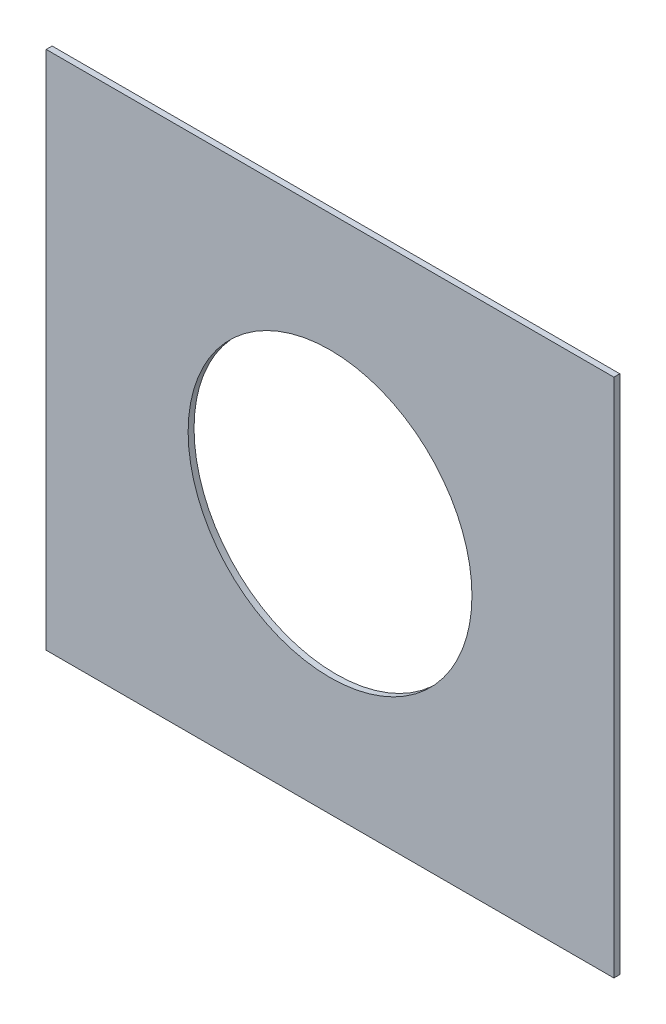
ISO-10303-21;
HEADER;
FILE_DESCRIPTION(('STEP AP214'),'2;1');
FILE_NAME('part.step','',(''),(''),'','','');
FILE_SCHEMA(('AUTOMOTIVE_DESIGN { 1 0 10303 214 1 1 1 1 }'));
ENDSEC;
DATA;
#1=APPLICATION_CONTEXT('core data for automotive mechanical design processes');
#2=APPLICATION_PROTOCOL_DEFINITION('international standard','automotive_design',2000,#1);
#3=PRODUCT_CONTEXT('',#1,'mechanical');
#4=PRODUCT('Part','Part','',(#3));
#5=PRODUCT_RELATED_PRODUCT_CATEGORY('part','',(#4));
#6=PRODUCT_DEFINITION_FORMATION('','',#4);
#7=PRODUCT_DEFINITION_CONTEXT('part definition',#1,'design');
#8=PRODUCT_DEFINITION('design','',#6,#7);
#9=PRODUCT_DEFINITION_SHAPE('','',#8);
#10=(LENGTH_UNIT() NAMED_UNIT(*) SI_UNIT(.MILLI.,.METRE.));
#11=(NAMED_UNIT(*) PLANE_ANGLE_UNIT() SI_UNIT($,.RADIAN.));
#12=(NAMED_UNIT(*) SI_UNIT($,.STERADIAN.) SOLID_ANGLE_UNIT());
#13=UNCERTAINTY_MEASURE_WITH_UNIT(LENGTH_MEASURE(1.E-05),#10,'distance_accuracy_value','');
#14=(GEOMETRIC_REPRESENTATION_CONTEXT(3) GLOBAL_UNCERTAINTY_ASSIGNED_CONTEXT((#13)) GLOBAL_UNIT_ASSIGNED_CONTEXT((#10,
#11,#12)) REPRESENTATION_CONTEXT('',''));
#15=CARTESIAN_POINT('',(0.,0.,0.));
#16=DIRECTION('',(0.,0.,1.));
#17=DIRECTION('',(1.,0.,0.));
#18=AXIS2_PLACEMENT_3D('',#15,#16,#17);
#19=CARTESIAN_POINT('',(1200.,-1100.,25.));
#20=DIRECTION('',(-1.,0.,0.));
#21=DIRECTION('',(0.,0.,1.));
#22=AXIS2_PLACEMENT_3D('',#19,#20,#21);
#23=PLANE('',#22);
#24=DIRECTION('',(0.,1.,0.));
#25=VECTOR('',#24,1.);
#26=CARTESIAN_POINT('',(1200.,-1100.,0.));
#27=LINE('',#26,#25);
#28=CARTESIAN_POINT('',(1200.,-1100.,0.));
#29=VERTEX_POINT('',#28);
#30=CARTESIAN_POINT('',(1200.,1100.,0.));
#31=VERTEX_POINT('',#30);
#32=EDGE_CURVE('E114',#29,#31,#27,.T.);
#33=ORIENTED_EDGE('',*,*,#32,.T.);
#34=DIRECTION('',(0.,0.,-1.));
#35=VECTOR('',#34,1.);
#36=CARTESIAN_POINT('',(1200.,1100.,25.));
#37=LINE('',#36,#35);
#38=CARTESIAN_POINT('',(1200.,1100.,25.));
#39=VERTEX_POINT('',#38);
#40=EDGE_CURVE('E11',#39,#31,#37,.T.);
#41=ORIENTED_EDGE('',*,*,#40,.F.);
#42=DIRECTION('',(0.,1.,0.));
#43=VECTOR('',#42,1.);
#44=CARTESIAN_POINT('',(1200.,-1100.,25.));
#45=LINE('',#44,#43);
#46=CARTESIAN_POINT('',(1200.,-1100.,25.));
#47=VERTEX_POINT('',#46);
#48=EDGE_CURVE('E97',#47,#39,#45,.T.);
#49=ORIENTED_EDGE('',*,*,#48,.F.);
#50=DIRECTION('',(0.,0.,-1.));
#51=VECTOR('',#50,1.);
#52=CARTESIAN_POINT('',(1200.,-1100.,25.));
#53=LINE('',#52,#51);
#54=EDGE_CURVE('E110',#47,#29,#53,.T.);
#55=ORIENTED_EDGE('',*,*,#54,.T.);
#56=EDGE_LOOP('',(#33,#41,#49,#55));
#57=FACE_BOUND('',#56,.T.);
#58=ADVANCED_FACE('F44',(#57),#23,.F.);
#59=CARTESIAN_POINT('',(-1200.,1100.,25.));
#60=DIRECTION('',(0.,-1.,0.));
#61=DIRECTION('',(0.,0.,-1.));
#62=AXIS2_PLACEMENT_3D('',#59,#60,#61);
#63=PLANE('',#62);
#64=DIRECTION('',(-1.,0.,0.));
#65=VECTOR('',#64,1.);
#66=CARTESIAN_POINT('',(-1200.,1100.,0.));
#67=LINE('',#66,#65);
#68=CARTESIAN_POINT('',(-1200.,1100.,0.));
#69=VERTEX_POINT('',#68);
#70=EDGE_CURVE('E102',#31,#69,#67,.T.);
#71=ORIENTED_EDGE('',*,*,#70,.T.);
#72=DIRECTION('',(0.,0.,-1.));
#73=VECTOR('',#72,1.);
#74=CARTESIAN_POINT('',(-1200.,1100.,25.));
#75=LINE('',#74,#73);
#76=CARTESIAN_POINT('',(-1200.,1100.,25.));
#77=VERTEX_POINT('',#76);
#78=EDGE_CURVE('E54',#77,#69,#75,.T.);
#79=ORIENTED_EDGE('',*,*,#78,.F.);
#80=DIRECTION('',(-1.,0.,0.));
#81=VECTOR('',#80,1.);
#82=CARTESIAN_POINT('',(-1200.,1100.,25.));
#83=LINE('',#82,#81);
#84=EDGE_CURVE('E92',#39,#77,#83,.T.);
#85=ORIENTED_EDGE('',*,*,#84,.F.);
#86=ORIENTED_EDGE('',*,*,#40,.T.);
#87=EDGE_LOOP('',(#71,#79,#85,#86));
#88=FACE_BOUND('',#87,.T.);
#89=ADVANCED_FACE('F101',(#88),#63,.F.);
#90=CARTESIAN_POINT('',(-1200.,-1100.,25.));
#91=DIRECTION('',(1.,0.,0.));
#92=DIRECTION('',(0.,0.,-1.));
#93=AXIS2_PLACEMENT_3D('',#90,#91,#92);
#94=PLANE('',#93);
#95=DIRECTION('',(0.,-1.,0.));
#96=VECTOR('',#95,1.);
#97=CARTESIAN_POINT('',(-1200.,-1100.,0.));
#98=LINE('',#97,#96);
#99=CARTESIAN_POINT('',(-1200.,-1100.,0.));
#100=VERTEX_POINT('',#99);
#101=EDGE_CURVE('E79',#69,#100,#98,.T.);
#102=ORIENTED_EDGE('',*,*,#101,.T.);
#103=DIRECTION('',(0.,0.,-1.));
#104=VECTOR('',#103,1.);
#105=CARTESIAN_POINT('',(-1200.,-1100.,25.));
#106=LINE('',#105,#104);
#107=CARTESIAN_POINT('',(-1200.,-1100.,25.));
#108=VERTEX_POINT('',#107);
#109=EDGE_CURVE('E104',#108,#100,#106,.T.);
#110=ORIENTED_EDGE('',*,*,#109,.F.);
#111=DIRECTION('',(0.,-1.,0.));
#112=VECTOR('',#111,1.);
#113=CARTESIAN_POINT('',(-1200.,-1100.,25.));
#114=LINE('',#113,#112);
#115=EDGE_CURVE('E95',#77,#108,#114,.T.);
#116=ORIENTED_EDGE('',*,*,#115,.F.);
#117=ORIENTED_EDGE('',*,*,#78,.T.);
#118=EDGE_LOOP('',(#102,#110,#116,#117));
#119=FACE_BOUND('',#118,.T.);
#120=ADVANCED_FACE('F106',(#119),#94,.F.);
#121=CARTESIAN_POINT('',(-1200.,-1100.,25.));
#122=DIRECTION('',(0.,1.,0.));
#123=DIRECTION('',(0.,0.,1.));
#124=AXIS2_PLACEMENT_3D('',#121,#122,#123);
#125=PLANE('',#124);
#126=DIRECTION('',(1.,0.,0.));
#127=VECTOR('',#126,1.);
#128=CARTESIAN_POINT('',(-1200.,-1100.,0.));
#129=LINE('',#128,#127);
#130=EDGE_CURVE('E85',#100,#29,#129,.T.);
#131=ORIENTED_EDGE('',*,*,#130,.T.);
#132=ORIENTED_EDGE('',*,*,#54,.F.);
#133=DIRECTION('',(1.,0.,0.));
#134=VECTOR('',#133,1.);
#135=CARTESIAN_POINT('',(-1200.,-1100.,25.));
#136=LINE('',#135,#134);
#137=EDGE_CURVE('E62',#108,#47,#136,.T.);
#138=ORIENTED_EDGE('',*,*,#137,.F.);
#139=ORIENTED_EDGE('',*,*,#109,.T.);
#140=EDGE_LOOP('',(#131,#132,#138,#139));
#141=FACE_BOUND('',#140,.T.);
#142=ADVANCED_FACE('F127',(#141),#125,.F.);
#143=CARTESIAN_POINT('',(0.,0.,25.));
#144=DIRECTION('',(0.,0.,-1.));
#145=DIRECTION('',(-1.,0.,0.));
#146=AXIS2_PLACEMENT_3D('',#143,#144,#145);
#147=PLANE('',#146);
#148=CARTESIAN_POINT('',(0.,0.,25.));
#149=DIRECTION('',(0.,0.,1.));
#150=DIRECTION('',(1.,0.,0.));
#151=AXIS2_PLACEMENT_3D('',#148,#149,#150);
#152=CIRCLE('',#151,600.);
#153=CARTESIAN_POINT('',(600.,0.,25.));
#154=VERTEX_POINT('',#153);
#155=EDGE_CURVE('E134',#154,#154,#152,.T.);
#156=ORIENTED_EDGE('',*,*,#155,.F.);
#157=EDGE_LOOP('',(#156));
#158=FACE_BOUND('',#157,.T.);
#159=ORIENTED_EDGE('',*,*,#48,.T.);
#160=ORIENTED_EDGE('',*,*,#84,.T.);
#161=ORIENTED_EDGE('',*,*,#115,.T.);
#162=ORIENTED_EDGE('',*,*,#137,.T.);
#163=EDGE_LOOP('',(#159,#160,#161,#162));
#164=FACE_BOUND('',#163,.T.);
#165=ADVANCED_FACE('F93',(#158,#164),#147,.F.);
#166=CARTESIAN_POINT('',(0.,0.,0.));
#167=DIRECTION('',(0.,0.,-1.));
#168=DIRECTION('',(-1.,0.,0.));
#169=AXIS2_PLACEMENT_3D('',#166,#167,#168);
#170=PLANE('',#169);
#171=CARTESIAN_POINT('',(0.,0.,0.));
#172=DIRECTION('',(0.,0.,-1.));
#173=DIRECTION('',(-1.,0.,0.));
#174=AXIS2_PLACEMENT_3D('',#171,#172,#173);
#175=CIRCLE('',#174,600.);
#176=CARTESIAN_POINT('',(-600.,0.,0.));
#177=VERTEX_POINT('',#176);
#178=EDGE_CURVE('E47',#177,#177,#175,.T.);
#179=ORIENTED_EDGE('',*,*,#178,.F.);
#180=EDGE_LOOP('',(#179));
#181=FACE_BOUND('',#180,.T.);
#182=ORIENTED_EDGE('',*,*,#32,.F.);
#183=ORIENTED_EDGE('',*,*,#130,.F.);
#184=ORIENTED_EDGE('',*,*,#101,.F.);
#185=ORIENTED_EDGE('',*,*,#70,.F.);
#186=EDGE_LOOP('',(#182,#183,#184,#185));
#187=FACE_BOUND('',#186,.T.);
#188=ADVANCED_FACE('F130',(#181,#187),#170,.T.);
#189=CARTESIAN_POINT('',(0.,0.,-6.99999999999995));
#190=DIRECTION('',(0.,0.,1.));
#191=DIRECTION('',(1.,0.,0.));
#192=AXIS2_PLACEMENT_3D('',#189,#190,#191);
#193=CYLINDRICAL_SURFACE('',#192,600.);
#194=ORIENTED_EDGE('',*,*,#178,.T.);
#195=EDGE_LOOP('',(#194));
#196=FACE_BOUND('',#195,.T.);
#197=ORIENTED_EDGE('',*,*,#155,.T.);
#198=EDGE_LOOP('',(#197));
#199=FACE_BOUND('',#198,.T.);
#200=ADVANCED_FACE('F143',(#196,#199),#193,.F.);
#201=CLOSED_SHELL('',(#58,#89,#120,#142,#165,#188,#200));
#202=MANIFOLD_SOLID_BREP('B2',#201);
#203=ADVANCED_BREP_SHAPE_REPRESENTATION('',(#18,#202),#14);
#204=SHAPE_DEFINITION_REPRESENTATION(#9,#203);
ENDSEC;
END-ISO-10303-21;
